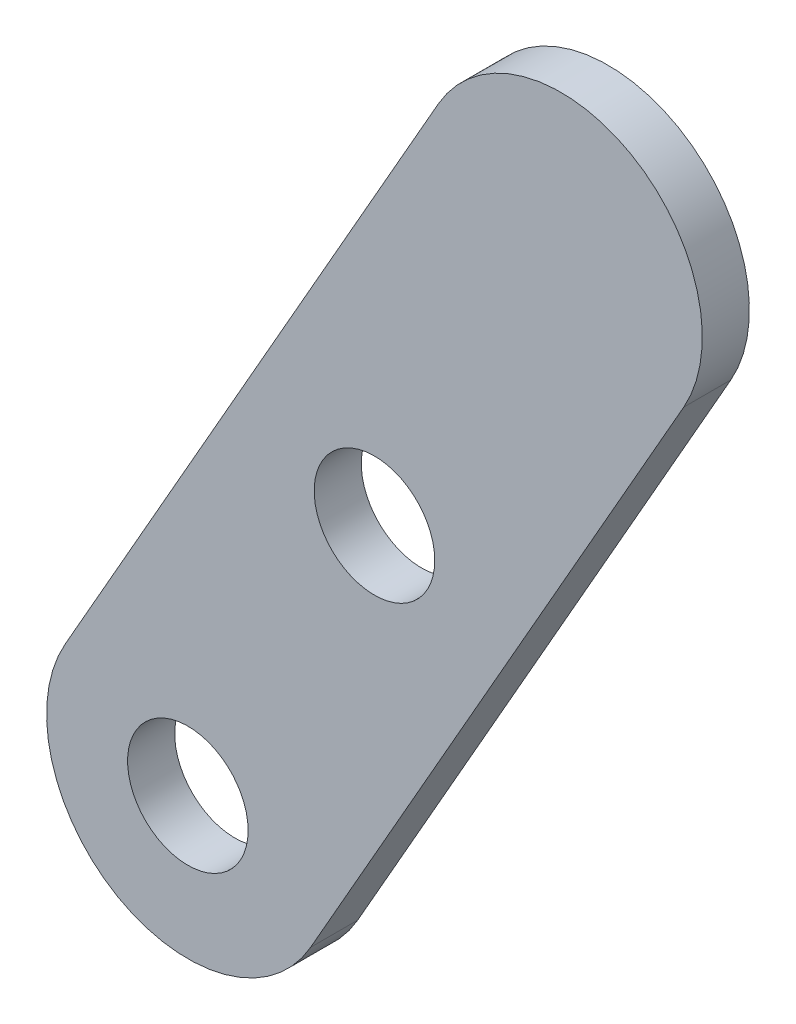
ISO-10303-21;
HEADER;
FILE_DESCRIPTION(('STEP AP214'),'2;1');
FILE_NAME('part.step','',(''),(''),'','','');
FILE_SCHEMA(('AUTOMOTIVE_DESIGN { 1 0 10303 214 1 1 1 1 }'));
ENDSEC;
DATA;
#1=APPLICATION_CONTEXT('core data for automotive mechanical design processes');
#2=APPLICATION_PROTOCOL_DEFINITION('international standard','automotive_design',2000,#1);
#3=PRODUCT_CONTEXT('',#1,'mechanical');
#4=PRODUCT('Part','Part','',(#3));
#5=PRODUCT_RELATED_PRODUCT_CATEGORY('part','',(#4));
#6=PRODUCT_DEFINITION_FORMATION('','',#4);
#7=PRODUCT_DEFINITION_CONTEXT('part definition',#1,'design');
#8=PRODUCT_DEFINITION('design','',#6,#7);
#9=PRODUCT_DEFINITION_SHAPE('','',#8);
#10=(LENGTH_UNIT() NAMED_UNIT(*) SI_UNIT(.MILLI.,.METRE.));
#11=(NAMED_UNIT(*) PLANE_ANGLE_UNIT() SI_UNIT($,.RADIAN.));
#12=(NAMED_UNIT(*) SI_UNIT($,.STERADIAN.) SOLID_ANGLE_UNIT());
#13=UNCERTAINTY_MEASURE_WITH_UNIT(LENGTH_MEASURE(1.E-05),#10,'distance_accuracy_value','');
#14=(GEOMETRIC_REPRESENTATION_CONTEXT(3) GLOBAL_UNCERTAINTY_ASSIGNED_CONTEXT((#13)) GLOBAL_UNIT_ASSIGNED_CONTEXT((#10,
#11,#12)) REPRESENTATION_CONTEXT('',''));
#15=CARTESIAN_POINT('',(0.,0.,0.));
#16=DIRECTION('',(0.,0.,1.));
#17=DIRECTION('',(1.,0.,0.));
#18=AXIS2_PLACEMENT_3D('',#15,#16,#17);
#19=CARTESIAN_POINT('',(0.,0.,1.5875));
#20=DIRECTION('',(0.,0.,1.));
#21=DIRECTION('',(1.,0.,0.));
#22=AXIS2_PLACEMENT_3D('',#19,#20,#21);
#23=PLANE('',#22);
#24=CARTESIAN_POINT('',(0.,0.,1.5875));
#25=DIRECTION('',(0.,0.,1.));
#26=DIRECTION('',(1.,0.,0.));
#27=AXIS2_PLACEMENT_3D('',#24,#25,#26);
#28=CIRCLE('',#27,2.032);
#29=CARTESIAN_POINT('',(2.032,0.,1.5875));
#30=VERTEX_POINT('',#29);
#31=EDGE_CURVE('E108',#30,#30,#28,.T.);
#32=ORIENTED_EDGE('',*,*,#31,.F.);
#33=EDGE_LOOP('',(#32));
#34=FACE_BOUND('',#33,.T.);
#35=CARTESIAN_POINT('',(0.,0.,1.5875));
#36=DIRECTION('',(0.,0.,1.));
#37=DIRECTION('',(1.,0.,0.));
#38=AXIS2_PLACEMENT_3D('',#35,#36,#37);
#39=CIRCLE('',#38,4.7625);
#40=CARTESIAN_POINT('',(-4.13716889440422,2.35907604565309,1.5875));
#41=VERTEX_POINT('',#40);
#42=CARTESIAN_POINT('',(4.13716889440422,-2.35907604565309,1.5875));
#43=VERTEX_POINT('',#42);
#44=EDGE_CURVE('E93',#41,#43,#39,.T.);
#45=ORIENTED_EDGE('',*,*,#44,.T.);
#46=DIRECTION('',(0.495344051580701,0.868696880714796,0.));
#47=VECTOR('',#46,1.);
#48=CARTESIAN_POINT('',(4.13716889440422,-2.35907604565309,1.5875));
#49=LINE('',#48,#47);
#50=CARTESIAN_POINT('',(16.718907804554,19.7058247245026,1.5875));
#51=VERTEX_POINT('',#50);
#52=EDGE_CURVE('E88',#43,#51,#49,.T.);
#53=ORIENTED_EDGE('',*,*,#52,.T.);
#54=CARTESIAN_POINT('',(12.5817389101497,22.0649007701557,1.5875));
#55=DIRECTION('',(0.,0.,1.));
#56=DIRECTION('',(1.,0.,0.));
#57=AXIS2_PLACEMENT_3D('',#54,#55,#56);
#58=CIRCLE('',#57,4.7625);
#59=CARTESIAN_POINT('',(8.44457001574552,24.4239768158088,1.5875));
#60=VERTEX_POINT('',#59);
#61=EDGE_CURVE('E91',#51,#60,#58,.T.);
#62=ORIENTED_EDGE('',*,*,#61,.T.);
#63=DIRECTION('',(-0.495344051580701,-0.868696880714796,0.));
#64=VECTOR('',#63,1.);
#65=CARTESIAN_POINT('',(-4.13716889440422,2.35907604565309,1.5875));
#66=LINE('',#65,#64);
#67=EDGE_CURVE('E58',#60,#41,#66,.T.);
#68=ORIENTED_EDGE('',*,*,#67,.T.);
#69=EDGE_LOOP('',(#45,#53,#62,#68));
#70=FACE_BOUND('',#69,.T.);
#71=CARTESIAN_POINT('',(6.29086945507487,11.0324503850779,1.5875));
#72=DIRECTION('',(0.,0.,1.));
#73=DIRECTION('',(1.,0.,0.));
#74=AXIS2_PLACEMENT_3D('',#71,#72,#73);
#75=CIRCLE('',#74,2.032);
#76=CARTESIAN_POINT('',(8.32286945507487,11.0324503850779,1.5875));
#77=VERTEX_POINT('',#76);
#78=EDGE_CURVE('E123',#77,#77,#75,.T.);
#79=ORIENTED_EDGE('',*,*,#78,.F.);
#80=EDGE_LOOP('',(#79));
#81=FACE_BOUND('',#80,.T.);
#82=ADVANCED_FACE('F41',(#34,#70,#81),#23,.T.);
#83=CARTESIAN_POINT('',(0.,0.,0.));
#84=DIRECTION('',(0.,0.,1.));
#85=DIRECTION('',(1.,0.,0.));
#86=AXIS2_PLACEMENT_3D('',#83,#84,#85);
#87=PLANE('',#86);
#88=CARTESIAN_POINT('',(0.,0.,0.));
#89=DIRECTION('',(0.,0.,1.));
#90=DIRECTION('',(1.,0.,0.));
#91=AXIS2_PLACEMENT_3D('',#88,#89,#90);
#92=CIRCLE('',#91,4.7625);
#93=CARTESIAN_POINT('',(-4.13716889440422,2.35907604565309,0.));
#94=VERTEX_POINT('',#93);
#95=CARTESIAN_POINT('',(4.13716889440422,-2.35907604565309,0.));
#96=VERTEX_POINT('',#95);
#97=EDGE_CURVE('E105',#94,#96,#92,.T.);
#98=ORIENTED_EDGE('',*,*,#97,.F.);
#99=DIRECTION('',(-0.495344051580701,-0.868696880714796,0.));
#100=VECTOR('',#99,1.);
#101=CARTESIAN_POINT('',(-4.13716889440422,2.35907604565309,0.));
#102=LINE('',#101,#100);
#103=CARTESIAN_POINT('',(8.44457001574552,24.4239768158088,0.));
#104=VERTEX_POINT('',#103);
#105=EDGE_CURVE('E81',#104,#94,#102,.T.);
#106=ORIENTED_EDGE('',*,*,#105,.F.);
#107=CARTESIAN_POINT('',(12.5817389101497,22.0649007701557,0.));
#108=DIRECTION('',(0.,0.,1.));
#109=DIRECTION('',(1.,0.,0.));
#110=AXIS2_PLACEMENT_3D('',#107,#108,#109);
#111=CIRCLE('',#110,4.7625);
#112=CARTESIAN_POINT('',(16.718907804554,19.7058247245026,0.));
#113=VERTEX_POINT('',#112);
#114=EDGE_CURVE('E75',#113,#104,#111,.T.);
#115=ORIENTED_EDGE('',*,*,#114,.F.);
#116=DIRECTION('',(0.495344051580701,0.868696880714796,0.));
#117=VECTOR('',#116,1.);
#118=CARTESIAN_POINT('',(4.13716889440422,-2.35907604565309,0.));
#119=LINE('',#118,#117);
#120=EDGE_CURVE('E97',#96,#113,#119,.T.);
#121=ORIENTED_EDGE('',*,*,#120,.F.);
#122=EDGE_LOOP('',(#98,#106,#115,#121));
#123=FACE_BOUND('',#122,.T.);
#124=CARTESIAN_POINT('',(0.,0.,0.));
#125=DIRECTION('',(0.,0.,1.));
#126=DIRECTION('',(1.,0.,0.));
#127=AXIS2_PLACEMENT_3D('',#124,#125,#126);
#128=CIRCLE('',#127,2.032);
#129=CARTESIAN_POINT('',(2.032,0.,0.));
#130=VERTEX_POINT('',#129);
#131=EDGE_CURVE('E120',#130,#130,#128,.T.);
#132=ORIENTED_EDGE('',*,*,#131,.T.);
#133=EDGE_LOOP('',(#132));
#134=FACE_BOUND('',#133,.T.);
#135=CARTESIAN_POINT('',(6.29086945507487,11.0324503850779,0.));
#136=DIRECTION('',(0.,0.,1.));
#137=DIRECTION('',(1.,0.,0.));
#138=AXIS2_PLACEMENT_3D('',#135,#136,#137);
#139=CIRCLE('',#138,2.032);
#140=CARTESIAN_POINT('',(8.32286945507487,11.0324503850779,0.));
#141=VERTEX_POINT('',#140);
#142=EDGE_CURVE('E126',#141,#141,#139,.T.);
#143=ORIENTED_EDGE('',*,*,#142,.T.);
#144=EDGE_LOOP('',(#143));
#145=FACE_BOUND('',#144,.T.);
#146=ADVANCED_FACE('F116',(#123,#134,#145),#87,.F.);
#147=CARTESIAN_POINT('',(0.,0.,1.5875));
#148=DIRECTION('',(0.,0.,-1.));
#149=DIRECTION('',(-1.,0.,0.));
#150=AXIS2_PLACEMENT_3D('',#147,#148,#149);
#151=CYLINDRICAL_SURFACE('',#150,4.7625);
#152=ORIENTED_EDGE('',*,*,#97,.T.);
#153=DIRECTION('',(0.,0.,-1.));
#154=VECTOR('',#153,1.);
#155=CARTESIAN_POINT('',(4.13716889440422,-2.35907604565309,1.5875));
#156=LINE('',#155,#154);
#157=EDGE_CURVE('E11',#43,#96,#156,.T.);
#158=ORIENTED_EDGE('',*,*,#157,.F.);
#159=ORIENTED_EDGE('',*,*,#44,.F.);
#160=DIRECTION('',(0.,0.,-1.));
#161=VECTOR('',#160,1.);
#162=CARTESIAN_POINT('',(-4.13716889440422,2.35907604565309,1.5875));
#163=LINE('',#162,#161);
#164=EDGE_CURVE('E101',#41,#94,#163,.T.);
#165=ORIENTED_EDGE('',*,*,#164,.T.);
#166=EDGE_LOOP('',(#152,#158,#159,#165));
#167=FACE_BOUND('',#166,.T.);
#168=ADVANCED_FACE('F43',(#167),#151,.T.);
#169=CARTESIAN_POINT('',(4.13716889440422,-2.35907604565309,1.5875));
#170=DIRECTION('',(-0.868696880714796,0.495344051580701,0.));
#171=DIRECTION('',(-0.495344051580701,-0.868696880714796,0.));
#172=AXIS2_PLACEMENT_3D('',#169,#170,#171);
#173=PLANE('',#172);
#174=ORIENTED_EDGE('',*,*,#120,.T.);
#175=DIRECTION('',(0.,0.,-1.));
#176=VECTOR('',#175,1.);
#177=CARTESIAN_POINT('',(16.718907804554,19.7058247245026,1.5875));
#178=LINE('',#177,#176);
#179=EDGE_CURVE('E50',#51,#113,#178,.T.);
#180=ORIENTED_EDGE('',*,*,#179,.F.);
#181=ORIENTED_EDGE('',*,*,#52,.F.);
#182=ORIENTED_EDGE('',*,*,#157,.T.);
#183=EDGE_LOOP('',(#174,#180,#181,#182));
#184=FACE_BOUND('',#183,.T.);
#185=ADVANCED_FACE('F96',(#184),#173,.F.);
#186=CARTESIAN_POINT('',(12.5817389101497,22.0649007701557,1.5875));
#187=DIRECTION('',(0.,0.,-1.));
#188=DIRECTION('',(-1.,0.,0.));
#189=AXIS2_PLACEMENT_3D('',#186,#187,#188);
#190=CYLINDRICAL_SURFACE('',#189,4.7625);
#191=ORIENTED_EDGE('',*,*,#114,.T.);
#192=DIRECTION('',(0.,0.,-1.));
#193=VECTOR('',#192,1.);
#194=CARTESIAN_POINT('',(8.44457001574552,24.4239768158088,1.5875));
#195=LINE('',#194,#193);
#196=EDGE_CURVE('E98',#60,#104,#195,.T.);
#197=ORIENTED_EDGE('',*,*,#196,.F.);
#198=ORIENTED_EDGE('',*,*,#61,.F.);
#199=ORIENTED_EDGE('',*,*,#179,.T.);
#200=EDGE_LOOP('',(#191,#197,#198,#199));
#201=FACE_BOUND('',#200,.T.);
#202=ADVANCED_FACE('F99',(#201),#190,.T.);
#203=CARTESIAN_POINT('',(-4.13716889440422,2.35907604565309,1.5875));
#204=DIRECTION('',(0.868696880714796,-0.495344051580701,0.));
#205=DIRECTION('',(0.495344051580701,0.868696880714796,0.));
#206=AXIS2_PLACEMENT_3D('',#203,#204,#205);
#207=PLANE('',#206);
#208=ORIENTED_EDGE('',*,*,#105,.T.);
#209=ORIENTED_EDGE('',*,*,#164,.F.);
#210=ORIENTED_EDGE('',*,*,#67,.F.);
#211=ORIENTED_EDGE('',*,*,#196,.T.);
#212=EDGE_LOOP('',(#208,#209,#210,#211));
#213=FACE_BOUND('',#212,.T.);
#214=ADVANCED_FACE('F113',(#213),#207,.F.);
#215=CARTESIAN_POINT('',(0.,0.,1.5875));
#216=DIRECTION('',(0.,0.,-1.));
#217=DIRECTION('',(-1.,0.,0.));
#218=AXIS2_PLACEMENT_3D('',#215,#216,#217);
#219=CYLINDRICAL_SURFACE('',#218,2.032);
#220=ORIENTED_EDGE('',*,*,#31,.T.);
#221=EDGE_LOOP('',(#220));
#222=FACE_BOUND('',#221,.T.);
#223=ORIENTED_EDGE('',*,*,#131,.F.);
#224=EDGE_LOOP('',(#223));
#225=FACE_BOUND('',#224,.T.);
#226=ADVANCED_FACE('F143',(#222,#225),#219,.F.);
#227=CARTESIAN_POINT('',(6.29086945507487,11.0324503850779,1.5875));
#228=DIRECTION('',(0.,0.,-1.));
#229=DIRECTION('',(-1.,0.,0.));
#230=AXIS2_PLACEMENT_3D('',#227,#228,#229);
#231=CYLINDRICAL_SURFACE('',#230,2.032);
#232=ORIENTED_EDGE('',*,*,#78,.T.);
#233=EDGE_LOOP('',(#232));
#234=FACE_BOUND('',#233,.T.);
#235=ORIENTED_EDGE('',*,*,#142,.F.);
#236=EDGE_LOOP('',(#235));
#237=FACE_BOUND('',#236,.T.);
#238=ADVANCED_FACE('F132',(#234,#237),#231,.F.);
#239=CLOSED_SHELL('',(#82,#146,#168,#185,#202,#214,#226,#238));
#240=MANIFOLD_SOLID_BREP('B2',#239);
#241=ADVANCED_BREP_SHAPE_REPRESENTATION('',(#18,#240),#14);
#242=SHAPE_DEFINITION_REPRESENTATION(#9,#241);
ENDSEC;
END-ISO-10303-21;
